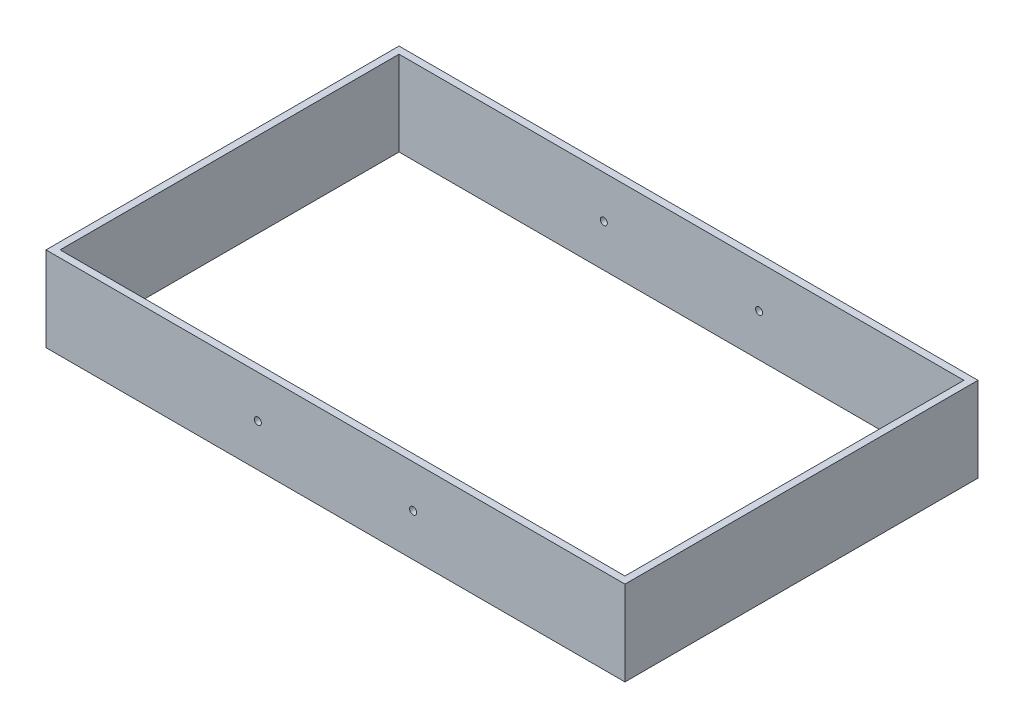
ISO-10303-21;
HEADER;
FILE_DESCRIPTION(('STEP AP214'),'2;1');
FILE_NAME('part.step','',(''),(''),'','','');
FILE_SCHEMA(('AUTOMOTIVE_DESIGN { 1 0 10303 214 1 1 1 1 }'));
ENDSEC;
DATA;
#1=APPLICATION_CONTEXT('core data for automotive mechanical design processes');
#2=APPLICATION_PROTOCOL_DEFINITION('international standard','automotive_design',2000,#1);
#3=PRODUCT_CONTEXT('',#1,'mechanical');
#4=PRODUCT('Part','Part','',(#3));
#5=PRODUCT_RELATED_PRODUCT_CATEGORY('part','',(#4));
#6=PRODUCT_DEFINITION_FORMATION('','',#4);
#7=PRODUCT_DEFINITION_CONTEXT('part definition',#1,'design');
#8=PRODUCT_DEFINITION('design','',#6,#7);
#9=PRODUCT_DEFINITION_SHAPE('','',#8);
#10=(LENGTH_UNIT() NAMED_UNIT(*) SI_UNIT(.MILLI.,.METRE.));
#11=(NAMED_UNIT(*) PLANE_ANGLE_UNIT() SI_UNIT($,.RADIAN.));
#12=(NAMED_UNIT(*) SI_UNIT($,.STERADIAN.) SOLID_ANGLE_UNIT());
#13=UNCERTAINTY_MEASURE_WITH_UNIT(LENGTH_MEASURE(1.E-05),#10,'distance_accuracy_value','');
#14=(GEOMETRIC_REPRESENTATION_CONTEXT(3) GLOBAL_UNCERTAINTY_ASSIGNED_CONTEXT((#13)) GLOBAL_UNIT_ASSIGNED_CONTEXT((#10,
#11,#12)) REPRESENTATION_CONTEXT('',''));
#15=CARTESIAN_POINT('',(0.,0.,0.));
#16=DIRECTION('',(0.,0.,1.));
#17=DIRECTION('',(1.,0.,0.));
#18=AXIS2_PLACEMENT_3D('',#15,#16,#17);
#19=CARTESIAN_POINT('',(-3.175,38.1,3.175));
#20=DIRECTION('',(0.,0.,-1.));
#21=DIRECTION('',(-1.,0.,0.));
#22=AXIS2_PLACEMENT_3D('',#19,#20,#21);
#23=PLANE('',#22);
#24=CARTESIAN_POINT('',(161.925,19.05,3.175));
#25=DIRECTION('',(0.,0.,1.));
#26=DIRECTION('',(1.,0.,0.));
#27=AXIS2_PLACEMENT_3D('',#24,#25,#26);
#28=CIRCLE('',#27,1.58749999999999);
#29=CARTESIAN_POINT('',(163.5125,19.05,3.175));
#30=VERTEX_POINT('',#29);
#31=EDGE_CURVE('E243',#30,#30,#28,.T.);
#32=ORIENTED_EDGE('',*,*,#31,.F.);
#33=EDGE_LOOP('',(#32));
#34=FACE_BOUND('',#33,.T.);
#35=CARTESIAN_POINT('',(92.075,19.05,3.175));
#36=DIRECTION('',(0.,0.,1.));
#37=DIRECTION('',(1.,0.,0.));
#38=AXIS2_PLACEMENT_3D('',#35,#36,#37);
#39=CIRCLE('',#38,1.5875);
#40=CARTESIAN_POINT('',(93.6625,19.05,3.175));
#41=VERTEX_POINT('',#40);
#42=EDGE_CURVE('E232',#41,#41,#39,.T.);
#43=ORIENTED_EDGE('',*,*,#42,.F.);
#44=EDGE_LOOP('',(#43));
#45=FACE_BOUND('',#44,.T.);
#46=DIRECTION('',(1.,0.,0.));
#47=VECTOR('',#46,1.);
#48=CARTESIAN_POINT('',(-3.175,0.,3.175));
#49=LINE('',#48,#47);
#50=CARTESIAN_POINT('',(-3.175,0.,3.175));
#51=VERTEX_POINT('',#50);
#52=CARTESIAN_POINT('',(257.175,0.,3.175));
#53=VERTEX_POINT('',#52);
#54=EDGE_CURVE('E179',#51,#53,#49,.T.);
#55=ORIENTED_EDGE('',*,*,#54,.T.);
#56=DIRECTION('',(0.,-1.,0.));
#57=VECTOR('',#56,1.);
#58=CARTESIAN_POINT('',(257.175,38.1,3.175));
#59=LINE('',#58,#57);
#60=CARTESIAN_POINT('',(257.175,38.1,3.175));
#61=VERTEX_POINT('',#60);
#62=EDGE_CURVE('E12',#61,#53,#59,.T.);
#63=ORIENTED_EDGE('',*,*,#62,.F.);
#64=DIRECTION('',(1.,0.,0.));
#65=VECTOR('',#64,1.);
#66=CARTESIAN_POINT('',(-3.175,38.1,3.175));
#67=LINE('',#66,#65);
#68=CARTESIAN_POINT('',(-3.175,38.1,3.175));
#69=VERTEX_POINT('',#68);
#70=EDGE_CURVE('E185',#69,#61,#67,.T.);
#71=ORIENTED_EDGE('',*,*,#70,.F.);
#72=DIRECTION('',(0.,-1.,0.));
#73=VECTOR('',#72,1.);
#74=CARTESIAN_POINT('',(-3.175,38.1,3.175));
#75=LINE('',#74,#73);
#76=EDGE_CURVE('E201',#69,#51,#75,.T.);
#77=ORIENTED_EDGE('',*,*,#76,.T.);
#78=EDGE_LOOP('',(#55,#63,#71,#77));
#79=FACE_BOUND('',#78,.T.);
#80=ADVANCED_FACE('F68',(#34,#45,#79),#23,.F.);
#81=CARTESIAN_POINT('',(257.175,38.1,3.175));
#82=DIRECTION('',(-1.,0.,0.));
#83=DIRECTION('',(0.,0.,1.));
#84=AXIS2_PLACEMENT_3D('',#81,#82,#83);
#85=PLANE('',#84);
#86=DIRECTION('',(0.,0.,-1.));
#87=VECTOR('',#86,1.);
#88=CARTESIAN_POINT('',(257.175,0.,3.175));
#89=LINE('',#88,#87);
#90=CARTESIAN_POINT('',(257.175,0.,-155.575));
#91=VERTEX_POINT('',#90);
#92=EDGE_CURVE('E205',#53,#91,#89,.T.);
#93=ORIENTED_EDGE('',*,*,#92,.T.);
#94=DIRECTION('',(0.,-1.,0.));
#95=VECTOR('',#94,1.);
#96=CARTESIAN_POINT('',(257.175,38.1,-155.575));
#97=LINE('',#96,#95);
#98=CARTESIAN_POINT('',(257.175,38.1,-155.575));
#99=VERTEX_POINT('',#98);
#100=EDGE_CURVE('E77',#99,#91,#97,.T.);
#101=ORIENTED_EDGE('',*,*,#100,.F.);
#102=DIRECTION('',(0.,0.,-1.));
#103=VECTOR('',#102,1.);
#104=CARTESIAN_POINT('',(257.175,38.1,3.175));
#105=LINE('',#104,#103);
#106=EDGE_CURVE('E189',#61,#99,#105,.T.);
#107=ORIENTED_EDGE('',*,*,#106,.F.);
#108=ORIENTED_EDGE('',*,*,#62,.T.);
#109=EDGE_LOOP('',(#93,#101,#107,#108));
#110=FACE_BOUND('',#109,.T.);
#111=ADVANCED_FACE('F273',(#110),#85,.F.);
#112=CARTESIAN_POINT('',(-3.175,38.1,-155.575));
#113=DIRECTION('',(0.,0.,-1.));
#114=DIRECTION('',(-1.,0.,0.));
#115=AXIS2_PLACEMENT_3D('',#112,#113,#114);
#116=PLANE('',#115);
#117=CARTESIAN_POINT('',(161.925,19.05,-155.575));
#118=DIRECTION('',(0.,0.,1.));
#119=DIRECTION('',(1.,0.,0.));
#120=AXIS2_PLACEMENT_3D('',#117,#118,#119);
#121=CIRCLE('',#120,1.58749999999999);
#122=CARTESIAN_POINT('',(163.5125,19.05,-155.575));
#123=VERTEX_POINT('',#122);
#124=EDGE_CURVE('E247',#123,#123,#121,.T.);
#125=ORIENTED_EDGE('',*,*,#124,.T.);
#126=EDGE_LOOP('',(#125));
#127=FACE_BOUND('',#126,.T.);
#128=CARTESIAN_POINT('',(92.075,19.05,-155.575));
#129=DIRECTION('',(0.,0.,1.));
#130=DIRECTION('',(1.,0.,0.));
#131=AXIS2_PLACEMENT_3D('',#128,#129,#130);
#132=CIRCLE('',#131,1.5875);
#133=CARTESIAN_POINT('',(93.6625,19.05,-155.575));
#134=VERTEX_POINT('',#133);
#135=EDGE_CURVE('E225',#134,#134,#132,.T.);
#136=ORIENTED_EDGE('',*,*,#135,.T.);
#137=EDGE_LOOP('',(#136));
#138=FACE_BOUND('',#137,.T.);
#139=DIRECTION('',(1.,0.,0.));
#140=VECTOR('',#139,1.);
#141=CARTESIAN_POINT('',(-3.175,0.,-155.575));
#142=LINE('',#141,#140);
#143=CARTESIAN_POINT('',(-3.175,0.,-155.575));
#144=VERTEX_POINT('',#143);
#145=EDGE_CURVE('E209',#144,#91,#142,.T.);
#146=ORIENTED_EDGE('',*,*,#145,.F.);
#147=DIRECTION('',(0.,-1.,0.));
#148=VECTOR('',#147,1.);
#149=CARTESIAN_POINT('',(-3.175,38.1,-155.575));
#150=LINE('',#149,#148);
#151=CARTESIAN_POINT('',(-3.175,38.1,-155.575));
#152=VERTEX_POINT('',#151);
#153=EDGE_CURVE('E218',#152,#144,#150,.T.);
#154=ORIENTED_EDGE('',*,*,#153,.F.);
#155=DIRECTION('',(1.,0.,0.));
#156=VECTOR('',#155,1.);
#157=CARTESIAN_POINT('',(-3.175,38.1,-155.575));
#158=LINE('',#157,#156);
#159=EDGE_CURVE('E193',#152,#99,#158,.T.);
#160=ORIENTED_EDGE('',*,*,#159,.T.);
#161=ORIENTED_EDGE('',*,*,#100,.T.);
#162=EDGE_LOOP('',(#146,#154,#160,#161));
#163=FACE_BOUND('',#162,.T.);
#164=ADVANCED_FACE('F279',(#127,#138,#163),#116,.T.);
#165=CARTESIAN_POINT('',(-3.175,38.1,3.175));
#166=DIRECTION('',(-1.,0.,0.));
#167=DIRECTION('',(0.,0.,1.));
#168=AXIS2_PLACEMENT_3D('',#165,#166,#167);
#169=PLANE('',#168);
#170=DIRECTION('',(0.,0.,-1.));
#171=VECTOR('',#170,1.);
#172=CARTESIAN_POINT('',(-3.175,0.,3.175));
#173=LINE('',#172,#171);
#174=EDGE_CURVE('E190',#51,#144,#173,.T.);
#175=ORIENTED_EDGE('',*,*,#174,.F.);
#176=ORIENTED_EDGE('',*,*,#76,.F.);
#177=DIRECTION('',(0.,0.,-1.));
#178=VECTOR('',#177,1.);
#179=CARTESIAN_POINT('',(-3.175,38.1,3.175));
#180=LINE('',#179,#178);
#181=EDGE_CURVE('E197',#69,#152,#180,.T.);
#182=ORIENTED_EDGE('',*,*,#181,.T.);
#183=ORIENTED_EDGE('',*,*,#153,.T.);
#184=EDGE_LOOP('',(#175,#176,#182,#183));
#185=FACE_BOUND('',#184,.T.);
#186=ADVANCED_FACE('F292',(#185),#169,.T.);
#187=CARTESIAN_POINT('',(0.,38.1,0.));
#188=DIRECTION('',(0.,1.,0.));
#189=DIRECTION('',(0.,0.,1.));
#190=AXIS2_PLACEMENT_3D('',#187,#188,#189);
#191=PLANE('',#190);
#192=DIRECTION('',(0.,0.,-1.));
#193=VECTOR('',#192,1.);
#194=CARTESIAN_POINT('',(0.,38.1,0.));
#195=LINE('',#194,#193);
#196=CARTESIAN_POINT('',(0.,38.1,0.));
#197=VERTEX_POINT('',#196);
#198=CARTESIAN_POINT('',(0.,38.1,-152.4));
#199=VERTEX_POINT('',#198);
#200=EDGE_CURVE('E137',#197,#199,#195,.T.);
#201=ORIENTED_EDGE('',*,*,#200,.T.);
#202=DIRECTION('',(1.,0.,0.));
#203=VECTOR('',#202,1.);
#204=CARTESIAN_POINT('',(0.,38.1,-152.4));
#205=LINE('',#204,#203);
#206=CARTESIAN_POINT('',(254.,38.1,-152.4));
#207=VERTEX_POINT('',#206);
#208=EDGE_CURVE('E144',#199,#207,#205,.T.);
#209=ORIENTED_EDGE('',*,*,#208,.T.);
#210=DIRECTION('',(0.,0.,-1.));
#211=VECTOR('',#210,1.);
#212=CARTESIAN_POINT('',(254.,38.1,0.));
#213=LINE('',#212,#211);
#214=CARTESIAN_POINT('',(254.,38.1,0.));
#215=VERTEX_POINT('',#214);
#216=EDGE_CURVE('E149',#215,#207,#213,.T.);
#217=ORIENTED_EDGE('',*,*,#216,.F.);
#218=DIRECTION('',(1.,0.,0.));
#219=VECTOR('',#218,1.);
#220=CARTESIAN_POINT('',(0.,38.1,0.));
#221=LINE('',#220,#219);
#222=EDGE_CURVE('E141',#197,#215,#221,.T.);
#223=ORIENTED_EDGE('',*,*,#222,.F.);
#224=EDGE_LOOP('',(#201,#209,#217,#223));
#225=FACE_BOUND('',#224,.T.);
#226=ORIENTED_EDGE('',*,*,#70,.T.);
#227=ORIENTED_EDGE('',*,*,#106,.T.);
#228=ORIENTED_EDGE('',*,*,#159,.F.);
#229=ORIENTED_EDGE('',*,*,#181,.F.);
#230=EDGE_LOOP('',(#226,#227,#228,#229));
#231=FACE_BOUND('',#230,.T.);
#232=ADVANCED_FACE('F151',(#225,#231),#191,.T.);
#233=CARTESIAN_POINT('',(0.,0.,0.));
#234=DIRECTION('',(0.,1.,0.));
#235=DIRECTION('',(0.,0.,1.));
#236=AXIS2_PLACEMENT_3D('',#233,#234,#235);
#237=PLANE('',#236);
#238=DIRECTION('',(1.,0.,0.));
#239=VECTOR('',#238,1.);
#240=CARTESIAN_POINT('',(0.,0.,-152.4));
#241=LINE('',#240,#239);
#242=CARTESIAN_POINT('',(0.,0.,-152.4));
#243=VERTEX_POINT('',#242);
#244=CARTESIAN_POINT('',(254.,0.,-152.4));
#245=VERTEX_POINT('',#244);
#246=EDGE_CURVE('E170',#243,#245,#241,.T.);
#247=ORIENTED_EDGE('',*,*,#246,.F.);
#248=DIRECTION('',(0.,0.,-1.));
#249=VECTOR('',#248,1.);
#250=CARTESIAN_POINT('',(0.,0.,0.));
#251=LINE('',#250,#249);
#252=CARTESIAN_POINT('',(0.,0.,0.));
#253=VERTEX_POINT('',#252);
#254=EDGE_CURVE('E93',#253,#243,#251,.T.);
#255=ORIENTED_EDGE('',*,*,#254,.F.);
#256=DIRECTION('',(1.,0.,0.));
#257=VECTOR('',#256,1.);
#258=CARTESIAN_POINT('',(0.,0.,0.));
#259=LINE('',#258,#257);
#260=CARTESIAN_POINT('',(254.,0.,0.));
#261=VERTEX_POINT('',#260);
#262=EDGE_CURVE('E154',#253,#261,#259,.T.);
#263=ORIENTED_EDGE('',*,*,#262,.T.);
#264=DIRECTION('',(0.,0.,-1.));
#265=VECTOR('',#264,1.);
#266=CARTESIAN_POINT('',(254.,0.,0.));
#267=LINE('',#266,#265);
#268=EDGE_CURVE('E158',#261,#245,#267,.T.);
#269=ORIENTED_EDGE('',*,*,#268,.T.);
#270=EDGE_LOOP('',(#247,#255,#263,#269));
#271=FACE_BOUND('',#270,.T.);
#272=ORIENTED_EDGE('',*,*,#54,.F.);
#273=ORIENTED_EDGE('',*,*,#174,.T.);
#274=ORIENTED_EDGE('',*,*,#145,.T.);
#275=ORIENTED_EDGE('',*,*,#92,.F.);
#276=EDGE_LOOP('',(#272,#273,#274,#275));
#277=FACE_BOUND('',#276,.T.);
#278=ADVANCED_FACE('F290',(#271,#277),#237,.F.);
#279=CARTESIAN_POINT('',(0.,38.1,0.));
#280=DIRECTION('',(-1.,0.,0.));
#281=DIRECTION('',(0.,0.,1.));
#282=AXIS2_PLACEMENT_3D('',#279,#280,#281);
#283=PLANE('',#282);
#284=ORIENTED_EDGE('',*,*,#254,.T.);
#285=DIRECTION('',(0.,-1.,0.));
#286=VECTOR('',#285,1.);
#287=CARTESIAN_POINT('',(0.,38.1,-152.4));
#288=LINE('',#287,#286);
#289=EDGE_CURVE('E134',#199,#243,#288,.T.);
#290=ORIENTED_EDGE('',*,*,#289,.F.);
#291=ORIENTED_EDGE('',*,*,#200,.F.);
#292=DIRECTION('',(0.,-1.,0.));
#293=VECTOR('',#292,1.);
#294=CARTESIAN_POINT('',(0.,38.1,0.));
#295=LINE('',#294,#293);
#296=EDGE_CURVE('E176',#197,#253,#295,.T.);
#297=ORIENTED_EDGE('',*,*,#296,.T.);
#298=EDGE_LOOP('',(#284,#290,#291,#297));
#299=FACE_BOUND('',#298,.T.);
#300=ADVANCED_FACE('F135',(#299),#283,.F.);
#301=CARTESIAN_POINT('',(0.,38.1,0.));
#302=DIRECTION('',(0.,0.,-1.));
#303=DIRECTION('',(-1.,0.,0.));
#304=AXIS2_PLACEMENT_3D('',#301,#302,#303);
#305=PLANE('',#304);
#306=CARTESIAN_POINT('',(161.925,19.05,0.));
#307=DIRECTION('',(0.,0.,-1.));
#308=DIRECTION('',(-1.,0.,0.));
#309=AXIS2_PLACEMENT_3D('',#306,#307,#308);
#310=CIRCLE('',#309,1.58749999999999);
#311=CARTESIAN_POINT('',(160.3375,19.05,0.));
#312=VERTEX_POINT('',#311);
#313=EDGE_CURVE('E238',#312,#312,#310,.T.);
#314=ORIENTED_EDGE('',*,*,#313,.F.);
#315=EDGE_LOOP('',(#314));
#316=FACE_BOUND('',#315,.T.);
#317=CARTESIAN_POINT('',(92.075,19.05,0.));
#318=DIRECTION('',(0.,0.,-1.));
#319=DIRECTION('',(-1.,0.,0.));
#320=AXIS2_PLACEMENT_3D('',#317,#318,#319);
#321=CIRCLE('',#320,1.5875);
#322=CARTESIAN_POINT('',(90.4875,19.05,0.));
#323=VERTEX_POINT('',#322);
#324=EDGE_CURVE('E161',#323,#323,#321,.T.);
#325=ORIENTED_EDGE('',*,*,#324,.F.);
#326=EDGE_LOOP('',(#325));
#327=FACE_BOUND('',#326,.T.);
#328=ORIENTED_EDGE('',*,*,#262,.F.);
#329=ORIENTED_EDGE('',*,*,#296,.F.);
#330=ORIENTED_EDGE('',*,*,#222,.T.);
#331=DIRECTION('',(0.,-1.,0.));
#332=VECTOR('',#331,1.);
#333=CARTESIAN_POINT('',(254.,38.1,0.));
#334=LINE('',#333,#332);
#335=EDGE_CURVE('E180',#215,#261,#334,.T.);
#336=ORIENTED_EDGE('',*,*,#335,.T.);
#337=EDGE_LOOP('',(#328,#329,#330,#336));
#338=FACE_BOUND('',#337,.T.);
#339=ADVANCED_FACE('F318',(#316,#327,#338),#305,.T.);
#340=CARTESIAN_POINT('',(254.,38.1,0.));
#341=DIRECTION('',(-1.,0.,0.));
#342=DIRECTION('',(0.,0.,1.));
#343=AXIS2_PLACEMENT_3D('',#340,#341,#342);
#344=PLANE('',#343);
#345=ORIENTED_EDGE('',*,*,#268,.F.);
#346=ORIENTED_EDGE('',*,*,#335,.F.);
#347=ORIENTED_EDGE('',*,*,#216,.T.);
#348=DIRECTION('',(0.,-1.,0.));
#349=VECTOR('',#348,1.);
#350=CARTESIAN_POINT('',(254.,38.1,-152.4));
#351=LINE('',#350,#349);
#352=EDGE_CURVE('E85',#207,#245,#351,.T.);
#353=ORIENTED_EDGE('',*,*,#352,.T.);
#354=EDGE_LOOP('',(#345,#346,#347,#353));
#355=FACE_BOUND('',#354,.T.);
#356=ADVANCED_FACE('F321',(#355),#344,.T.);
#357=CARTESIAN_POINT('',(0.,38.1,-152.4));
#358=DIRECTION('',(0.,0.,-1.));
#359=DIRECTION('',(-1.,0.,0.));
#360=AXIS2_PLACEMENT_3D('',#357,#358,#359);
#361=PLANE('',#360);
#362=CARTESIAN_POINT('',(161.925,19.05,-152.4));
#363=DIRECTION('',(0.,0.,-1.));
#364=DIRECTION('',(-1.,0.,0.));
#365=AXIS2_PLACEMENT_3D('',#362,#363,#364);
#366=CIRCLE('',#365,1.58749999999999);
#367=CARTESIAN_POINT('',(160.3375,19.05,-152.4));
#368=VERTEX_POINT('',#367);
#369=EDGE_CURVE('E71',#368,#368,#366,.T.);
#370=ORIENTED_EDGE('',*,*,#369,.T.);
#371=EDGE_LOOP('',(#370));
#372=FACE_BOUND('',#371,.T.);
#373=CARTESIAN_POINT('',(92.075,19.05,-152.4));
#374=DIRECTION('',(0.,0.,-1.));
#375=DIRECTION('',(-1.,0.,0.));
#376=AXIS2_PLACEMENT_3D('',#373,#374,#375);
#377=CIRCLE('',#376,1.5875);
#378=CARTESIAN_POINT('',(90.4875,19.05,-152.4));
#379=VERTEX_POINT('',#378);
#380=EDGE_CURVE('E222',#379,#379,#377,.T.);
#381=ORIENTED_EDGE('',*,*,#380,.T.);
#382=EDGE_LOOP('',(#381));
#383=FACE_BOUND('',#382,.T.);
#384=ORIENTED_EDGE('',*,*,#246,.T.);
#385=ORIENTED_EDGE('',*,*,#352,.F.);
#386=ORIENTED_EDGE('',*,*,#208,.F.);
#387=ORIENTED_EDGE('',*,*,#289,.T.);
#388=EDGE_LOOP('',(#384,#385,#386,#387));
#389=FACE_BOUND('',#388,.T.);
#390=ADVANCED_FACE('F145',(#372,#383,#389),#361,.F.);
#391=CARTESIAN_POINT('',(92.075,19.05,-155.575));
#392=DIRECTION('',(0.,0.,1.));
#393=DIRECTION('',(1.,0.,0.));
#394=AXIS2_PLACEMENT_3D('',#391,#392,#393);
#395=CYLINDRICAL_SURFACE('',#394,1.5875);
#396=ORIENTED_EDGE('',*,*,#135,.F.);
#397=EDGE_LOOP('',(#396));
#398=FACE_BOUND('',#397,.T.);
#399=ORIENTED_EDGE('',*,*,#380,.F.);
#400=EDGE_LOOP('',(#399));
#401=FACE_BOUND('',#400,.T.);
#402=ADVANCED_FACE('F269',(#398,#401),#395,.F.);
#403=ORIENTED_EDGE('',*,*,#324,.T.);
#404=EDGE_LOOP('',(#403));
#405=FACE_BOUND('',#404,.T.);
#406=ORIENTED_EDGE('',*,*,#42,.T.);
#407=EDGE_LOOP('',(#406));
#408=FACE_BOUND('',#407,.T.);
#409=ADVANCED_FACE('F260',(#405,#408),#395,.F.);
#410=CARTESIAN_POINT('',(161.925,19.05,-155.575));
#411=DIRECTION('',(0.,0.,1.));
#412=DIRECTION('',(1.,0.,0.));
#413=AXIS2_PLACEMENT_3D('',#410,#411,#412);
#414=CYLINDRICAL_SURFACE('',#413,1.58749999999999);
#415=ORIENTED_EDGE('',*,*,#124,.F.);
#416=EDGE_LOOP('',(#415));
#417=FACE_BOUND('',#416,.T.);
#418=ORIENTED_EDGE('',*,*,#369,.F.);
#419=EDGE_LOOP('',(#418));
#420=FACE_BOUND('',#419,.T.);
#421=ADVANCED_FACE('F257',(#417,#420),#414,.F.);
#422=ORIENTED_EDGE('',*,*,#313,.T.);
#423=EDGE_LOOP('',(#422));
#424=FACE_BOUND('',#423,.T.);
#425=ORIENTED_EDGE('',*,*,#31,.T.);
#426=EDGE_LOOP('',(#425));
#427=FACE_BOUND('',#426,.T.);
#428=ADVANCED_FACE('F259',(#424,#427),#414,.F.);
#429=CLOSED_SHELL('',(#80,#111,#164,#186,#232,#278,#300,#339,#356,#390,#402,#409,#421,#428));
#430=MANIFOLD_SOLID_BREP('B2',#429);
#431=ADVANCED_BREP_SHAPE_REPRESENTATION('',(#18,#430),#14);
#432=SHAPE_DEFINITION_REPRESENTATION(#9,#431);
ENDSEC;
END-ISO-10303-21;
